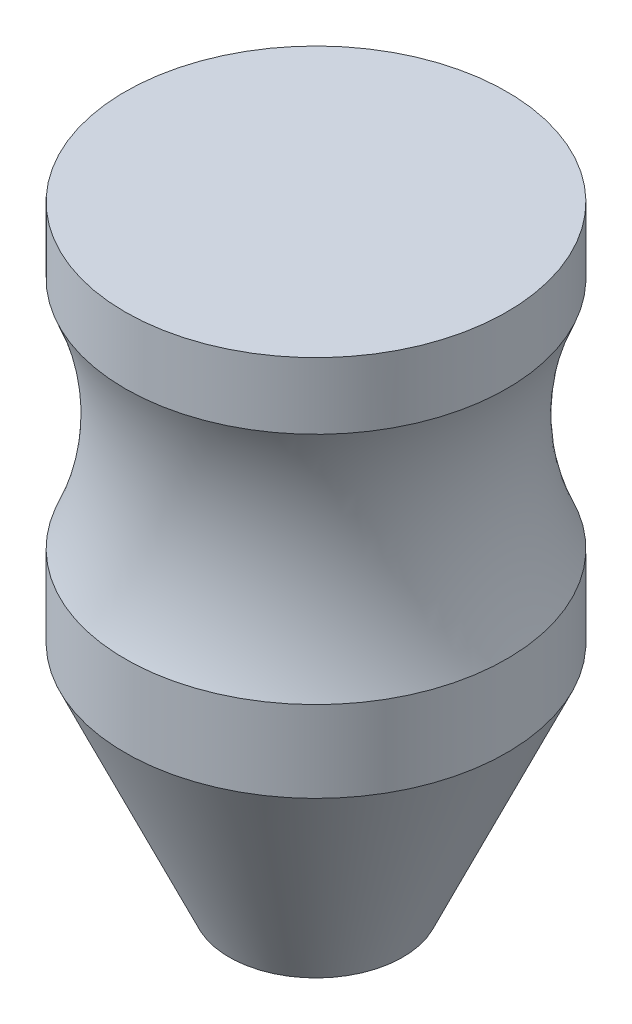
ISO-10303-21;
HEADER;
FILE_DESCRIPTION(('STEP AP214'),'2;1');
FILE_NAME('part.step','',(''),(''),'','','');
FILE_SCHEMA(('AUTOMOTIVE_DESIGN { 1 0 10303 214 1 1 1 1 }'));
ENDSEC;
DATA;
#1=APPLICATION_CONTEXT('core data for automotive mechanical design processes');
#2=APPLICATION_PROTOCOL_DEFINITION('international standard','automotive_design',2000,#1);
#3=PRODUCT_CONTEXT('',#1,'mechanical');
#4=PRODUCT('Part','Part','',(#3));
#5=PRODUCT_RELATED_PRODUCT_CATEGORY('part','',(#4));
#6=PRODUCT_DEFINITION_FORMATION('','',#4);
#7=PRODUCT_DEFINITION_CONTEXT('part definition',#1,'design');
#8=PRODUCT_DEFINITION('design','',#6,#7);
#9=PRODUCT_DEFINITION_SHAPE('','',#8);
#10=(LENGTH_UNIT() NAMED_UNIT(*) SI_UNIT(.MILLI.,.METRE.));
#11=(NAMED_UNIT(*) PLANE_ANGLE_UNIT() SI_UNIT($,.RADIAN.));
#12=(NAMED_UNIT(*) SI_UNIT($,.STERADIAN.) SOLID_ANGLE_UNIT());
#13=UNCERTAINTY_MEASURE_WITH_UNIT(LENGTH_MEASURE(1.E-05),#10,'distance_accuracy_value','');
#14=(GEOMETRIC_REPRESENTATION_CONTEXT(3) GLOBAL_UNCERTAINTY_ASSIGNED_CONTEXT((#13)) GLOBAL_UNIT_ASSIGNED_CONTEXT((#10,
#11,#12)) REPRESENTATION_CONTEXT('',''));
#15=CARTESIAN_POINT('',(0.,0.,0.));
#16=DIRECTION('',(0.,0.,1.));
#17=DIRECTION('',(1.,0.,0.));
#18=AXIS2_PLACEMENT_3D('',#15,#16,#17);
#19=CARTESIAN_POINT('',(0.,-30.,0.));
#20=DIRECTION('',(0.,1.,0.));
#21=DIRECTION('',(0.,0.,1.));
#22=AXIS2_PLACEMENT_3D('',#19,#20,#21);
#23=CYLINDRICAL_SURFACE('',#22,25.);
#24=CARTESIAN_POINT('',(0.,10.643181842377,0.));
#25=DIRECTION('',(0.,-1.,0.));
#26=DIRECTION('',(0.,0.,-1.));
#27=AXIS2_PLACEMENT_3D('',#24,#25,#26);
#28=CIRCLE('',#27,25.);
#29=CARTESIAN_POINT('',(0.,10.643181842377,-25.));
#30=VERTEX_POINT('',#29);
#31=EDGE_CURVE('E63',#30,#30,#28,.T.);
#32=ORIENTED_EDGE('',*,*,#31,.T.);
#33=EDGE_LOOP('',(#32));
#34=FACE_BOUND('',#33,.T.);
#35=CARTESIAN_POINT('',(0.,0.,0.));
#36=DIRECTION('',(0.,-1.,0.));
#37=DIRECTION('',(0.,0.,-1.));
#38=AXIS2_PLACEMENT_3D('',#35,#36,#37);
#39=CIRCLE('',#38,25.);
#40=CARTESIAN_POINT('',(0.,0.,-25.));
#41=VERTEX_POINT('',#40);
#42=EDGE_CURVE('E52',#41,#41,#39,.T.);
#43=ORIENTED_EDGE('',*,*,#42,.F.);
#44=EDGE_LOOP('',(#43));
#45=FACE_BOUND('',#44,.T.);
#46=ADVANCED_FACE('F39',(#34,#45),#23,.T.);
#47=CARTESIAN_POINT('',(0.,0.,0.));
#48=DIRECTION('',(0.,1.,0.));
#49=DIRECTION('',(0.,0.,1.));
#50=AXIS2_PLACEMENT_3D('',#47,#48,#49);
#51=CONICAL_SURFACE('',#50,25.,0.426166387618573);
#52=CARTESIAN_POINT('',(0.,-30.,0.));
#53=DIRECTION('',(0.,-1.,0.));
#54=DIRECTION('',(0.,0.,-1.));
#55=AXIS2_PLACEMENT_3D('',#52,#53,#54);
#56=CIRCLE('',#55,11.380324124417);
#57=CARTESIAN_POINT('',(0.,-30.,-11.380324124417));
#58=VERTEX_POINT('',#57);
#59=EDGE_CURVE('E47',#58,#58,#56,.T.);
#60=ORIENTED_EDGE('',*,*,#59,.F.);
#61=EDGE_LOOP('',(#60));
#62=FACE_BOUND('',#61,.T.);
#63=ORIENTED_EDGE('',*,*,#42,.T.);
#64=EDGE_LOOP('',(#63));
#65=FACE_BOUND('',#64,.T.);
#66=ADVANCED_FACE('F85',(#62,#65),#51,.T.);
#67=CARTESIAN_POINT('',(0.,-30.,0.));
#68=DIRECTION('',(0.,1.,0.));
#69=DIRECTION('',(0.,0.,1.));
#70=AXIS2_PLACEMENT_3D('',#67,#68,#69);
#71=PLANE('',#70);
#72=ORIENTED_EDGE('',*,*,#59,.T.);
#73=EDGE_LOOP('',(#72));
#74=FACE_BOUND('',#73,.T.);
#75=ADVANCED_FACE('F74',(#74),#71,.F.);
#76=CARTESIAN_POINT('',(0.,25.9723490856958,0.));
#77=DIRECTION('',(0.,-1.,0.));
#78=DIRECTION('',(0.,0.,-1.));
#79=AXIS2_PLACEMENT_3D('',#76,#77,#78);
#80=TOROIDAL_SURFACE('',#79,59.654393505427,37.8934078383381);
#81=ORIENTED_EDGE('',*,*,#31,.F.);
#82=EDGE_LOOP('',(#81));
#83=FACE_BOUND('',#82,.T.);
#84=CARTESIAN_POINT('',(0.,41.3015163290147,0.));
#85=DIRECTION('',(0.,-1.,0.));
#86=DIRECTION('',(0.,0.,-1.));
#87=AXIS2_PLACEMENT_3D('',#84,#85,#86);
#88=CIRCLE('',#87,25.);
#89=CARTESIAN_POINT('',(0.,41.3015163290147,-25.));
#90=VERTEX_POINT('',#89);
#91=EDGE_CURVE('E57',#90,#90,#88,.T.);
#92=ORIENTED_EDGE('',*,*,#91,.T.);
#93=EDGE_LOOP('',(#92));
#94=FACE_BOUND('',#93,.T.);
#95=ADVANCED_FACE('F70',(#83,#94),#80,.F.);
#96=CARTESIAN_POINT('',(0.,50.,0.));
#97=DIRECTION('',(0.,1.,0.));
#98=DIRECTION('',(0.,0.,1.));
#99=AXIS2_PLACEMENT_3D('',#96,#97,#98);
#100=PLANE('',#99);
#101=CARTESIAN_POINT('',(0.,50.,0.));
#102=DIRECTION('',(0.,1.,0.));
#103=DIRECTION('',(0.,0.,1.));
#104=AXIS2_PLACEMENT_3D('',#101,#102,#103);
#105=CIRCLE('',#104,25.);
#106=CARTESIAN_POINT('',(0.,50.,25.));
#107=VERTEX_POINT('',#106);
#108=EDGE_CURVE('E10',#107,#107,#105,.T.);
#109=ORIENTED_EDGE('',*,*,#108,.T.);
#110=EDGE_LOOP('',(#109));
#111=FACE_BOUND('',#110,.T.);
#112=ADVANCED_FACE('F73',(#111),#100,.T.);
#113=ORIENTED_EDGE('',*,*,#91,.F.);
#114=EDGE_LOOP('',(#113));
#115=FACE_BOUND('',#114,.T.);
#116=ORIENTED_EDGE('',*,*,#108,.F.);
#117=EDGE_LOOP('',(#116));
#118=FACE_BOUND('',#117,.T.);
#119=ADVANCED_FACE('F41',(#115,#118),#23,.T.);
#120=CLOSED_SHELL('',(#46,#66,#75,#95,#112,#119));
#121=MANIFOLD_SOLID_BREP('B2',#120);
#122=ADVANCED_BREP_SHAPE_REPRESENTATION('',(#18,#121),#14);
#123=SHAPE_DEFINITION_REPRESENTATION(#9,#122);
ENDSEC;
END-ISO-10303-21;
